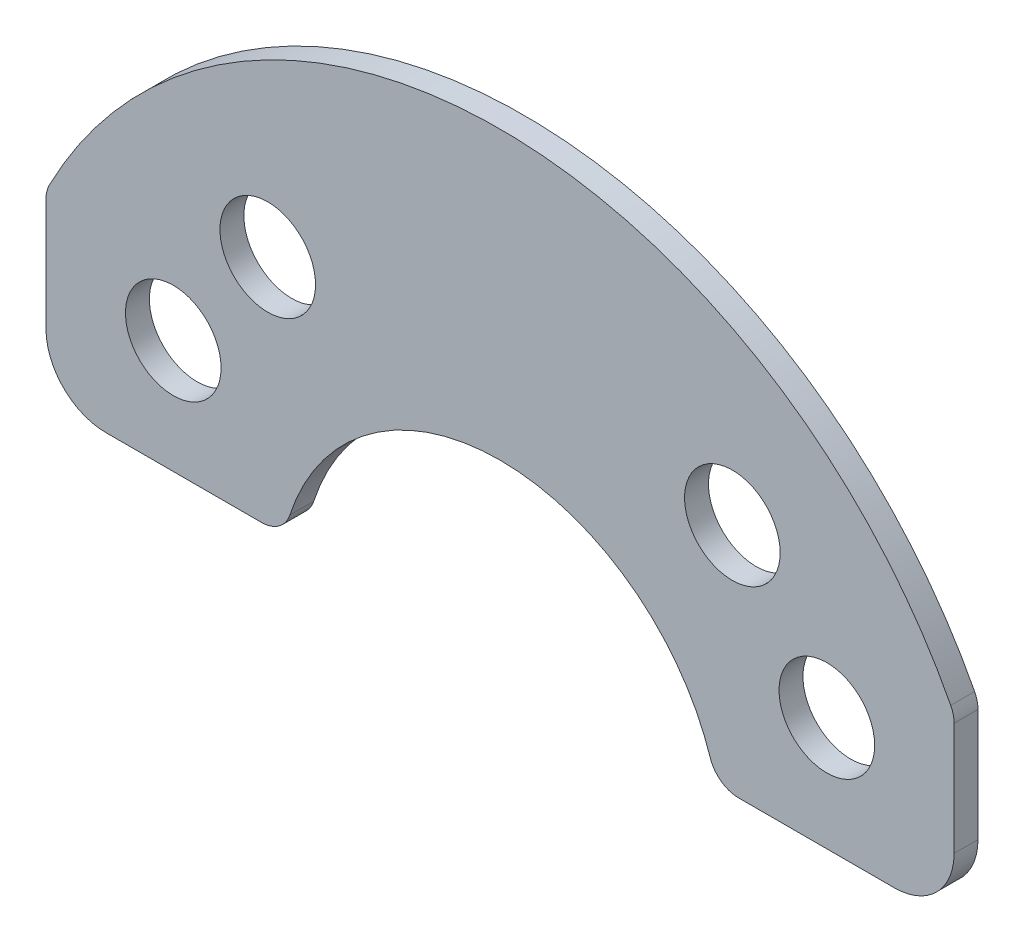
ISO-10303-21;
HEADER;
FILE_DESCRIPTION(('STEP AP214'),'2;1');
FILE_NAME('part.step','',(''),(''),'','','');
FILE_SCHEMA(('AUTOMOTIVE_DESIGN { 1 0 10303 214 1 1 1 1 }'));
ENDSEC;
DATA;
#1=APPLICATION_CONTEXT('core data for automotive mechanical design processes');
#2=APPLICATION_PROTOCOL_DEFINITION('international standard','automotive_design',2000,#1);
#3=PRODUCT_CONTEXT('',#1,'mechanical');
#4=PRODUCT('Part','Part','',(#3));
#5=PRODUCT_RELATED_PRODUCT_CATEGORY('part','',(#4));
#6=PRODUCT_DEFINITION_FORMATION('','',#4);
#7=PRODUCT_DEFINITION_CONTEXT('part definition',#1,'design');
#8=PRODUCT_DEFINITION('design','',#6,#7);
#9=PRODUCT_DEFINITION_SHAPE('','',#8);
#10=(LENGTH_UNIT() NAMED_UNIT(*) SI_UNIT(.MILLI.,.METRE.));
#11=(NAMED_UNIT(*) PLANE_ANGLE_UNIT() SI_UNIT($,.RADIAN.));
#12=(NAMED_UNIT(*) SI_UNIT($,.STERADIAN.) SOLID_ANGLE_UNIT());
#13=UNCERTAINTY_MEASURE_WITH_UNIT(LENGTH_MEASURE(1.E-05),#10,'distance_accuracy_value','');
#14=(GEOMETRIC_REPRESENTATION_CONTEXT(3) GLOBAL_UNCERTAINTY_ASSIGNED_CONTEXT((#13)) GLOBAL_UNIT_ASSIGNED_CONTEXT((#10,
#11,#12)) REPRESENTATION_CONTEXT('',''));
#15=CARTESIAN_POINT('',(0.,0.,0.));
#16=DIRECTION('',(0.,0.,1.));
#17=DIRECTION('',(1.,0.,0.));
#18=AXIS2_PLACEMENT_3D('',#15,#16,#17);
#19=CARTESIAN_POINT('',(-38.,4.,1.));
#20=DIRECTION('',(1.,0.,0.));
#21=DIRECTION('',(0.,1.,0.));
#22=AXIS2_PLACEMENT_3D('',#19,#20,#21);
#23=PLANE('',#22);
#24=DIRECTION('',(0.,-1.,0.));
#25=VECTOR('',#24,1.);
#26=CARTESIAN_POINT('',(-38.,4.,1.));
#27=LINE('',#26,#25);
#28=CARTESIAN_POINT('',(-38.,18.4323085911668,1.));
#29=VERTEX_POINT('',#28);
#30=CARTESIAN_POINT('',(-38.,9.,1.));
#31=VERTEX_POINT('',#30);
#32=EDGE_CURVE('E155',#29,#31,#27,.T.);
#33=ORIENTED_EDGE('',*,*,#32,.F.);
#34=DIRECTION('',(0.,0.,-1.));
#35=VECTOR('',#34,1.);
#36=CARTESIAN_POINT('',(-38.,18.4323085911668,1.));
#37=LINE('',#36,#35);
#38=CARTESIAN_POINT('',(-38.,18.4323085911668,-1.));
#39=VERTEX_POINT('',#38);
#40=EDGE_CURVE('E174',#29,#39,#37,.T.);
#41=ORIENTED_EDGE('',*,*,#40,.T.);
#42=DIRECTION('',(0.,-1.,0.));
#43=VECTOR('',#42,1.);
#44=CARTESIAN_POINT('',(-38.,4.,-1.));
#45=LINE('',#44,#43);
#46=CARTESIAN_POINT('',(-38.,9.,-1.));
#47=VERTEX_POINT('',#46);
#48=EDGE_CURVE('E213',#39,#47,#45,.T.);
#49=ORIENTED_EDGE('',*,*,#48,.T.);
#50=DIRECTION('',(0.,0.,-1.));
#51=VECTOR('',#50,1.);
#52=CARTESIAN_POINT('',(-38.,9.,1.));
#53=LINE('',#52,#51);
#54=EDGE_CURVE('E171',#47,#31,#53,.F.);
#55=ORIENTED_EDGE('',*,*,#54,.T.);
#56=EDGE_LOOP('',(#33,#41,#49,#55));
#57=FACE_BOUND('',#56,.T.);
#58=ADVANCED_FACE('F33',(#57),#23,.F.);
#59=CARTESIAN_POINT('',(-38.,4.,1.));
#60=DIRECTION('',(0.,1.,0.));
#61=DIRECTION('',(-1.,0.,0.));
#62=AXIS2_PLACEMENT_3D('',#59,#60,#61);
#63=PLANE('',#62);
#64=DIRECTION('',(1.,0.,0.));
#65=VECTOR('',#64,1.);
#66=CARTESIAN_POINT('',(-38.,4.,-1.));
#67=LINE('',#66,#65);
#68=CARTESIAN_POINT('',(-33.,4.,-1.));
#69=VERTEX_POINT('',#68);
#70=CARTESIAN_POINT('',(-19.9687255477159,4.,-1.));
#71=VERTEX_POINT('',#70);
#72=EDGE_CURVE('E234',#69,#71,#67,.T.);
#73=ORIENTED_EDGE('',*,*,#72,.T.);
#74=DIRECTION('',(0.,0.,-1.));
#75=VECTOR('',#74,1.);
#76=CARTESIAN_POINT('',(-19.9687255477159,4.,1.));
#77=LINE('',#76,#75);
#78=CARTESIAN_POINT('',(-19.9687255477159,4.,1.));
#79=VERTEX_POINT('',#78);
#80=EDGE_CURVE('E200',#71,#79,#77,.F.);
#81=ORIENTED_EDGE('',*,*,#80,.T.);
#82=DIRECTION('',(1.,0.,0.));
#83=VECTOR('',#82,1.);
#84=CARTESIAN_POINT('',(-38.,4.,1.));
#85=LINE('',#84,#83);
#86=CARTESIAN_POINT('',(-33.,4.,1.));
#87=VERTEX_POINT('',#86);
#88=EDGE_CURVE('E222',#87,#79,#85,.T.);
#89=ORIENTED_EDGE('',*,*,#88,.F.);
#90=DIRECTION('',(0.,0.,-1.));
#91=VECTOR('',#90,1.);
#92=CARTESIAN_POINT('',(-33.,4.,1.));
#93=LINE('',#92,#91);
#94=EDGE_CURVE('E168',#87,#69,#93,.T.);
#95=ORIENTED_EDGE('',*,*,#94,.T.);
#96=EDGE_LOOP('',(#73,#81,#89,#95));
#97=FACE_BOUND('',#96,.T.);
#98=ADVANCED_FACE('F253',(#97),#63,.F.);
#99=CARTESIAN_POINT('',(0.,0.,1.));
#100=DIRECTION('',(0.,0.,-1.));
#101=DIRECTION('',(-1.,0.,0.));
#102=AXIS2_PLACEMENT_3D('',#99,#100,#101);
#103=CYLINDRICAL_SURFACE('',#102,18.5);
#104=CARTESIAN_POINT('',(0.,0.,1.));
#105=DIRECTION('',(0.,0.,-1.));
#106=DIRECTION('',(1.,0.,0.));
#107=AXIS2_PLACEMENT_3D('',#104,#105,#106);
#108=CIRCLE('',#107,18.5);
#109=CARTESIAN_POINT('',(-17.5914963158449,5.72619047619048,1.));
#110=VERTEX_POINT('',#109);
#111=CARTESIAN_POINT('',(17.5914963158449,5.72619047619048,1.));
#112=VERTEX_POINT('',#111);
#113=EDGE_CURVE('E224',#110,#112,#108,.T.);
#114=ORIENTED_EDGE('',*,*,#113,.F.);
#115=DIRECTION('',(0.,0.,-1.));
#116=VECTOR('',#115,1.);
#117=CARTESIAN_POINT('',(-17.5914963158449,5.72619047619048,1.));
#118=LINE('',#117,#116);
#119=CARTESIAN_POINT('',(-17.5914963158449,5.72619047619048,-1.));
#120=VERTEX_POINT('',#119);
#121=EDGE_CURVE('E197',#110,#120,#118,.T.);
#122=ORIENTED_EDGE('',*,*,#121,.T.);
#123=CARTESIAN_POINT('',(0.,0.,-1.));
#124=DIRECTION('',(0.,0.,-1.));
#125=DIRECTION('',(1.,0.,0.));
#126=AXIS2_PLACEMENT_3D('',#123,#124,#125);
#127=CIRCLE('',#126,18.5);
#128=CARTESIAN_POINT('',(17.5914963158449,5.72619047619048,-1.));
#129=VERTEX_POINT('',#128);
#130=EDGE_CURVE('E157',#120,#129,#127,.T.);
#131=ORIENTED_EDGE('',*,*,#130,.T.);
#132=DIRECTION('',(0.,0.,-1.));
#133=VECTOR('',#132,1.);
#134=CARTESIAN_POINT('',(17.5914963158449,5.72619047619048,1.));
#135=LINE('',#134,#133);
#136=EDGE_CURVE('E48',#129,#112,#135,.F.);
#137=ORIENTED_EDGE('',*,*,#136,.T.);
#138=EDGE_LOOP('',(#114,#122,#131,#137));
#139=FACE_BOUND('',#138,.T.);
#140=ADVANCED_FACE('F238',(#139),#103,.F.);
#141=CARTESIAN_POINT('',(18.0623918681884,4.00000000000001,1.));
#142=DIRECTION('',(0.,1.,0.));
#143=DIRECTION('',(-1.,0.,0.));
#144=AXIS2_PLACEMENT_3D('',#141,#142,#143);
#145=PLANE('',#144);
#146=DIRECTION('',(1.,0.,0.));
#147=VECTOR('',#146,1.);
#148=CARTESIAN_POINT('',(18.0623918681884,4.00000000000001,1.));
#149=LINE('',#148,#147);
#150=CARTESIAN_POINT('',(19.9687255477159,4.00000000000001,1.));
#151=VERTEX_POINT('',#150);
#152=CARTESIAN_POINT('',(33.,4.,1.));
#153=VERTEX_POINT('',#152);
#154=EDGE_CURVE('E206',#151,#153,#149,.T.);
#155=ORIENTED_EDGE('',*,*,#154,.F.);
#156=DIRECTION('',(0.,0.,-1.));
#157=VECTOR('',#156,1.);
#158=CARTESIAN_POINT('',(19.9687255477159,4.00000000000001,1.));
#159=LINE('',#158,#157);
#160=CARTESIAN_POINT('',(19.9687255477159,4.00000000000001,-1.));
#161=VERTEX_POINT('',#160);
#162=EDGE_CURVE('E11',#151,#161,#159,.T.);
#163=ORIENTED_EDGE('',*,*,#162,.T.);
#164=DIRECTION('',(1.,0.,0.));
#165=VECTOR('',#164,1.);
#166=CARTESIAN_POINT('',(18.0623918681884,4.00000000000001,-1.));
#167=LINE('',#166,#165);
#168=CARTESIAN_POINT('',(33.,4.,-1.));
#169=VERTEX_POINT('',#168);
#170=EDGE_CURVE('E152',#161,#169,#167,.T.);
#171=ORIENTED_EDGE('',*,*,#170,.T.);
#172=DIRECTION('',(0.,0.,-1.));
#173=VECTOR('',#172,1.);
#174=CARTESIAN_POINT('',(33.,4.,1.));
#175=LINE('',#174,#173);
#176=EDGE_CURVE('E131',#169,#153,#175,.F.);
#177=ORIENTED_EDGE('',*,*,#176,.T.);
#178=EDGE_LOOP('',(#155,#163,#171,#177));
#179=FACE_BOUND('',#178,.T.);
#180=ADVANCED_FACE('F245',(#179),#145,.F.);
#181=CARTESIAN_POINT('',(38.,4.,1.));
#182=DIRECTION('',(-1.,0.,0.));
#183=DIRECTION('',(0.,-1.,0.));
#184=AXIS2_PLACEMENT_3D('',#181,#182,#183);
#185=PLANE('',#184);
#186=DIRECTION('',(0.,1.,0.));
#187=VECTOR('',#186,1.);
#188=CARTESIAN_POINT('',(38.,4.,-1.));
#189=LINE('',#188,#187);
#190=CARTESIAN_POINT('',(38.,9.,-1.));
#191=VERTEX_POINT('',#190);
#192=CARTESIAN_POINT('',(38.,18.4323085911668,-1.));
#193=VERTEX_POINT('',#192);
#194=EDGE_CURVE('E141',#191,#193,#189,.T.);
#195=ORIENTED_EDGE('',*,*,#194,.T.);
#196=DIRECTION('',(0.,0.,-1.));
#197=VECTOR('',#196,1.);
#198=CARTESIAN_POINT('',(38.,18.4323085911668,1.));
#199=LINE('',#198,#197);
#200=CARTESIAN_POINT('',(38.,18.4323085911668,1.));
#201=VERTEX_POINT('',#200);
#202=EDGE_CURVE('E41',#193,#201,#199,.F.);
#203=ORIENTED_EDGE('',*,*,#202,.T.);
#204=DIRECTION('',(0.,1.,0.));
#205=VECTOR('',#204,1.);
#206=CARTESIAN_POINT('',(38.,4.,1.));
#207=LINE('',#206,#205);
#208=CARTESIAN_POINT('',(38.,9.,1.));
#209=VERTEX_POINT('',#208);
#210=EDGE_CURVE('E144',#209,#201,#207,.T.);
#211=ORIENTED_EDGE('',*,*,#210,.F.);
#212=DIRECTION('',(0.,0.,-1.));
#213=VECTOR('',#212,1.);
#214=CARTESIAN_POINT('',(38.,9.,1.));
#215=LINE('',#214,#213);
#216=EDGE_CURVE('E129',#209,#191,#215,.T.);
#217=ORIENTED_EDGE('',*,*,#216,.T.);
#218=EDGE_LOOP('',(#195,#203,#211,#217));
#219=FACE_BOUND('',#218,.T.);
#220=ADVANCED_FACE('F140',(#219),#185,.F.);
#221=CARTESIAN_POINT('',(0.,0.,1.));
#222=DIRECTION('',(0.,0.,-1.));
#223=DIRECTION('',(-1.,0.,0.));
#224=AXIS2_PLACEMENT_3D('',#221,#222,#223);
#225=CYLINDRICAL_SURFACE('',#224,42.5);
#226=CARTESIAN_POINT('',(0.,0.,-1.));
#227=DIRECTION('',(0.,0.,1.));
#228=DIRECTION('',(1.,0.,0.));
#229=AXIS2_PLACEMENT_3D('',#226,#227,#228);
#230=CIRCLE('',#229,42.5);
#231=CARTESIAN_POINT('',(37.71875,19.5843278781147,-1.));
#232=VERTEX_POINT('',#231);
#233=CARTESIAN_POINT('',(-37.71875,19.5843278781147,-1.));
#234=VERTEX_POINT('',#233);
#235=EDGE_CURVE('E151',#232,#234,#230,.T.);
#236=ORIENTED_EDGE('',*,*,#235,.T.);
#237=DIRECTION('',(0.,0.,-1.));
#238=VECTOR('',#237,1.);
#239=CARTESIAN_POINT('',(-37.71875,19.5843278781147,1.));
#240=LINE('',#239,#238);
#241=CARTESIAN_POINT('',(-37.71875,19.5843278781147,1.));
#242=VERTEX_POINT('',#241);
#243=EDGE_CURVE('E187',#234,#242,#240,.F.);
#244=ORIENTED_EDGE('',*,*,#243,.T.);
#245=CARTESIAN_POINT('',(0.,0.,1.));
#246=DIRECTION('',(0.,0.,1.));
#247=DIRECTION('',(1.,0.,0.));
#248=AXIS2_PLACEMENT_3D('',#245,#246,#247);
#249=CIRCLE('',#248,42.5);
#250=CARTESIAN_POINT('',(37.71875,19.5843278781147,1.));
#251=VERTEX_POINT('',#250);
#252=EDGE_CURVE('E145',#251,#242,#249,.T.);
#253=ORIENTED_EDGE('',*,*,#252,.F.);
#254=DIRECTION('',(0.,0.,-1.));
#255=VECTOR('',#254,1.);
#256=CARTESIAN_POINT('',(37.71875,19.5843278781147,1.));
#257=LINE('',#256,#255);
#258=EDGE_CURVE('E184',#251,#232,#257,.T.);
#259=ORIENTED_EDGE('',*,*,#258,.T.);
#260=EDGE_LOOP('',(#236,#244,#253,#259));
#261=FACE_BOUND('',#260,.T.);
#262=ADVANCED_FACE('F211',(#261),#225,.T.);
#263=CARTESIAN_POINT('',(0.,0.,1.));
#264=DIRECTION('',(0.,0.,1.));
#265=DIRECTION('',(1.,0.,0.));
#266=AXIS2_PLACEMENT_3D('',#263,#264,#265);
#267=PLANE('',#266);
#268=CARTESIAN_POINT('',(27.3495886623547,13.5,1.));
#269=DIRECTION('',(0.,0.,1.));
#270=DIRECTION('',(1.,0.,0.));
#271=AXIS2_PLACEMENT_3D('',#268,#269,#270);
#272=CIRCLE('',#271,4.);
#273=CARTESIAN_POINT('',(31.3495886623547,13.5,1.));
#274=VERTEX_POINT('',#273);
#275=EDGE_CURVE('E410',#274,#274,#272,.T.);
#276=ORIENTED_EDGE('',*,*,#275,.F.);
#277=EDGE_LOOP('',(#276));
#278=FACE_BOUND('',#277,.T.);
#279=CARTESIAN_POINT('',(19.4422220952236,23.5,1.));
#280=DIRECTION('',(0.,0.,1.));
#281=DIRECTION('',(1.,0.,0.));
#282=AXIS2_PLACEMENT_3D('',#279,#280,#281);
#283=CIRCLE('',#282,4.);
#284=CARTESIAN_POINT('',(23.4422220952236,23.5,1.));
#285=VERTEX_POINT('',#284);
#286=EDGE_CURVE('E412',#285,#285,#283,.T.);
#287=ORIENTED_EDGE('',*,*,#286,.F.);
#288=EDGE_LOOP('',(#287));
#289=FACE_BOUND('',#288,.T.);
#290=CARTESIAN_POINT('',(-19.4422220952236,23.5,1.));
#291=DIRECTION('',(0.,0.,1.));
#292=DIRECTION('',(1.,0.,0.));
#293=AXIS2_PLACEMENT_3D('',#290,#291,#292);
#294=CIRCLE('',#293,4.);
#295=CARTESIAN_POINT('',(-15.4422220952236,23.5,1.));
#296=VERTEX_POINT('',#295);
#297=EDGE_CURVE('E423',#296,#296,#294,.T.);
#298=ORIENTED_EDGE('',*,*,#297,.F.);
#299=EDGE_LOOP('',(#298));
#300=FACE_BOUND('',#299,.T.);
#301=CARTESIAN_POINT('',(-27.3495886623547,13.5,1.));
#302=DIRECTION('',(0.,0.,1.));
#303=DIRECTION('',(1.,0.,0.));
#304=AXIS2_PLACEMENT_3D('',#301,#302,#303);
#305=CIRCLE('',#304,4.);
#306=CARTESIAN_POINT('',(-23.3495886623547,13.5,1.));
#307=VERTEX_POINT('',#306);
#308=EDGE_CURVE('E227',#307,#307,#305,.T.);
#309=ORIENTED_EDGE('',*,*,#308,.F.);
#310=EDGE_LOOP('',(#309));
#311=FACE_BOUND('',#310,.T.);
#312=ORIENTED_EDGE('',*,*,#252,.T.);
#313=CARTESIAN_POINT('',(-35.5,18.4323085911668,1.));
#314=DIRECTION('',(0.,0.,1.));
#315=DIRECTION('',(1.,0.,0.));
#316=AXIS2_PLACEMENT_3D('',#313,#314,#315);
#317=CIRCLE('',#316,2.5);
#318=EDGE_CURVE('E194',#242,#29,#317,.T.);
#319=ORIENTED_EDGE('',*,*,#318,.T.);
#320=ORIENTED_EDGE('',*,*,#32,.T.);
#321=CARTESIAN_POINT('',(-33.,9.,1.));
#322=DIRECTION('',(0.,0.,1.));
#323=DIRECTION('',(1.,0.,0.));
#324=AXIS2_PLACEMENT_3D('',#321,#322,#323);
#325=CIRCLE('',#324,5.);
#326=EDGE_CURVE('E164',#31,#87,#325,.T.);
#327=ORIENTED_EDGE('',*,*,#326,.T.);
#328=ORIENTED_EDGE('',*,*,#88,.T.);
#329=CARTESIAN_POINT('',(-19.9687255477159,6.5,1.));
#330=DIRECTION('',(0.,0.,1.));
#331=DIRECTION('',(1.,0.,0.));
#332=AXIS2_PLACEMENT_3D('',#329,#330,#331);
#333=CIRCLE('',#332,2.5);
#334=EDGE_CURVE('E55',#79,#110,#333,.T.);
#335=ORIENTED_EDGE('',*,*,#334,.T.);
#336=ORIENTED_EDGE('',*,*,#113,.T.);
#337=CARTESIAN_POINT('',(19.9687255477159,6.50000000000001,1.));
#338=DIRECTION('',(0.,0.,1.));
#339=DIRECTION('',(1.,0.,0.));
#340=AXIS2_PLACEMENT_3D('',#337,#338,#339);
#341=CIRCLE('',#340,2.5);
#342=EDGE_CURVE('E189',#112,#151,#341,.T.);
#343=ORIENTED_EDGE('',*,*,#342,.T.);
#344=ORIENTED_EDGE('',*,*,#154,.T.);
#345=CARTESIAN_POINT('',(33.,9.,1.));
#346=DIRECTION('',(0.,0.,1.));
#347=DIRECTION('',(1.,0.,0.));
#348=AXIS2_PLACEMENT_3D('',#345,#346,#347);
#349=CIRCLE('',#348,5.);
#350=EDGE_CURVE('E166',#153,#209,#349,.T.);
#351=ORIENTED_EDGE('',*,*,#350,.T.);
#352=ORIENTED_EDGE('',*,*,#210,.T.);
#353=CARTESIAN_POINT('',(35.5,18.4323085911668,1.));
#354=DIRECTION('',(0.,0.,1.));
#355=DIRECTION('',(1.,0.,0.));
#356=AXIS2_PLACEMENT_3D('',#353,#354,#355);
#357=CIRCLE('',#356,2.5);
#358=EDGE_CURVE('E191',#201,#251,#357,.T.);
#359=ORIENTED_EDGE('',*,*,#358,.T.);
#360=EDGE_LOOP('',(#312,#319,#320,#327,#328,#335,#336,#343,#344,#351,#352,#359));
#361=FACE_BOUND('',#360,.T.);
#362=ADVANCED_FACE('F204',(#278,#289,#300,#311,#361),#267,.T.);
#363=CARTESIAN_POINT('',(0.,0.,-1.));
#364=DIRECTION('',(0.,0.,1.));
#365=DIRECTION('',(1.,0.,0.));
#366=AXIS2_PLACEMENT_3D('',#363,#364,#365);
#367=PLANE('',#366);
#368=CARTESIAN_POINT('',(27.3495886623547,13.5,-1.));
#369=DIRECTION('',(0.,0.,1.));
#370=DIRECTION('',(1.,0.,0.));
#371=AXIS2_PLACEMENT_3D('',#368,#369,#370);
#372=CIRCLE('',#371,4.);
#373=CARTESIAN_POINT('',(31.3495886623547,13.5,-1.));
#374=VERTEX_POINT('',#373);
#375=EDGE_CURVE('E407',#374,#374,#372,.T.);
#376=ORIENTED_EDGE('',*,*,#375,.T.);
#377=EDGE_LOOP('',(#376));
#378=FACE_BOUND('',#377,.T.);
#379=CARTESIAN_POINT('',(19.4422220952236,23.5,-1.));
#380=DIRECTION('',(0.,0.,1.));
#381=DIRECTION('',(1.,0.,0.));
#382=AXIS2_PLACEMENT_3D('',#379,#380,#381);
#383=CIRCLE('',#382,4.);
#384=CARTESIAN_POINT('',(23.4422220952236,23.5,-1.));
#385=VERTEX_POINT('',#384);
#386=EDGE_CURVE('E428',#385,#385,#383,.T.);
#387=ORIENTED_EDGE('',*,*,#386,.T.);
#388=EDGE_LOOP('',(#387));
#389=FACE_BOUND('',#388,.T.);
#390=CARTESIAN_POINT('',(-19.4422220952236,23.5,-1.));
#391=DIRECTION('',(0.,0.,1.));
#392=DIRECTION('',(1.,0.,0.));
#393=AXIS2_PLACEMENT_3D('',#390,#391,#392);
#394=CIRCLE('',#393,4.);
#395=CARTESIAN_POINT('',(-15.4422220952236,23.5,-1.));
#396=VERTEX_POINT('',#395);
#397=EDGE_CURVE('E419',#396,#396,#394,.T.);
#398=ORIENTED_EDGE('',*,*,#397,.T.);
#399=EDGE_LOOP('',(#398));
#400=FACE_BOUND('',#399,.T.);
#401=CARTESIAN_POINT('',(-27.3495886623547,13.5,-1.));
#402=DIRECTION('',(0.,0.,1.));
#403=DIRECTION('',(1.,0.,0.));
#404=AXIS2_PLACEMENT_3D('',#401,#402,#403);
#405=CIRCLE('',#404,4.);
#406=CARTESIAN_POINT('',(-23.3495886623547,13.5,-1.));
#407=VERTEX_POINT('',#406);
#408=EDGE_CURVE('E235',#407,#407,#405,.T.);
#409=ORIENTED_EDGE('',*,*,#408,.T.);
#410=EDGE_LOOP('',(#409));
#411=FACE_BOUND('',#410,.T.);
#412=ORIENTED_EDGE('',*,*,#48,.F.);
#413=CARTESIAN_POINT('',(-35.5,18.4323085911668,-1.));
#414=DIRECTION('',(0.,0.,1.));
#415=DIRECTION('',(1.,0.,0.));
#416=AXIS2_PLACEMENT_3D('',#413,#414,#415);
#417=CIRCLE('',#416,2.5);
#418=EDGE_CURVE('E182',#39,#234,#417,.F.);
#419=ORIENTED_EDGE('',*,*,#418,.T.);
#420=ORIENTED_EDGE('',*,*,#235,.F.);
#421=CARTESIAN_POINT('',(35.5,18.4323085911668,-1.));
#422=DIRECTION('',(0.,0.,1.));
#423=DIRECTION('',(1.,0.,0.));
#424=AXIS2_PLACEMENT_3D('',#421,#422,#423);
#425=CIRCLE('',#424,2.5);
#426=EDGE_CURVE('E150',#232,#193,#425,.F.);
#427=ORIENTED_EDGE('',*,*,#426,.T.);
#428=ORIENTED_EDGE('',*,*,#194,.F.);
#429=CARTESIAN_POINT('',(33.,9.,-1.));
#430=DIRECTION('',(0.,0.,1.));
#431=DIRECTION('',(1.,0.,0.));
#432=AXIS2_PLACEMENT_3D('',#429,#430,#431);
#433=CIRCLE('',#432,5.);
#434=EDGE_CURVE('E125',#191,#169,#433,.F.);
#435=ORIENTED_EDGE('',*,*,#434,.T.);
#436=ORIENTED_EDGE('',*,*,#170,.F.);
#437=CARTESIAN_POINT('',(19.9687255477159,6.50000000000001,-1.));
#438=DIRECTION('',(0.,0.,1.));
#439=DIRECTION('',(1.,0.,0.));
#440=AXIS2_PLACEMENT_3D('',#437,#438,#439);
#441=CIRCLE('',#440,2.5);
#442=EDGE_CURVE('E177',#161,#129,#441,.F.);
#443=ORIENTED_EDGE('',*,*,#442,.T.);
#444=ORIENTED_EDGE('',*,*,#130,.F.);
#445=CARTESIAN_POINT('',(-19.9687255477159,6.5,-1.));
#446=DIRECTION('',(0.,0.,1.));
#447=DIRECTION('',(1.,0.,0.));
#448=AXIS2_PLACEMENT_3D('',#445,#446,#447);
#449=CIRCLE('',#448,2.5);
#450=EDGE_CURVE('E180',#120,#71,#449,.F.);
#451=ORIENTED_EDGE('',*,*,#450,.T.);
#452=ORIENTED_EDGE('',*,*,#72,.F.);
#453=CARTESIAN_POINT('',(-33.,9.,-1.));
#454=DIRECTION('',(0.,0.,1.));
#455=DIRECTION('',(1.,0.,0.));
#456=AXIS2_PLACEMENT_3D('',#453,#454,#455);
#457=CIRCLE('',#456,5.);
#458=EDGE_CURVE('E135',#69,#47,#457,.F.);
#459=ORIENTED_EDGE('',*,*,#458,.T.);
#460=EDGE_LOOP('',(#412,#419,#420,#427,#428,#435,#436,#443,#444,#451,#452,#459));
#461=FACE_BOUND('',#460,.T.);
#462=ADVANCED_FACE('F148',(#378,#389,#400,#411,#461),#367,.F.);
#463=CARTESIAN_POINT('',(-27.3495886623547,13.5,-1.));
#464=DIRECTION('',(0.,0.,1.));
#465=DIRECTION('',(1.,0.,0.));
#466=AXIS2_PLACEMENT_3D('',#463,#464,#465);
#467=CYLINDRICAL_SURFACE('',#466,4.);
#468=ORIENTED_EDGE('',*,*,#408,.F.);
#469=EDGE_LOOP('',(#468));
#470=FACE_BOUND('',#469,.T.);
#471=ORIENTED_EDGE('',*,*,#308,.T.);
#472=EDGE_LOOP('',(#471));
#473=FACE_BOUND('',#472,.T.);
#474=ADVANCED_FACE('F307',(#470,#473),#467,.F.);
#475=CARTESIAN_POINT('',(-19.4422220952236,23.5,-1.));
#476=DIRECTION('',(0.,0.,1.));
#477=DIRECTION('',(1.,0.,0.));
#478=AXIS2_PLACEMENT_3D('',#475,#476,#477);
#479=CYLINDRICAL_SURFACE('',#478,4.);
#480=ORIENTED_EDGE('',*,*,#397,.F.);
#481=EDGE_LOOP('',(#480));
#482=FACE_BOUND('',#481,.T.);
#483=ORIENTED_EDGE('',*,*,#297,.T.);
#484=EDGE_LOOP('',(#483));
#485=FACE_BOUND('',#484,.T.);
#486=ADVANCED_FACE('F362',(#482,#485),#479,.F.);
#487=CARTESIAN_POINT('',(19.4422220952236,23.5,-1.));
#488=DIRECTION('',(0.,0.,1.));
#489=DIRECTION('',(1.,0.,0.));
#490=AXIS2_PLACEMENT_3D('',#487,#488,#489);
#491=CYLINDRICAL_SURFACE('',#490,4.);
#492=ORIENTED_EDGE('',*,*,#386,.F.);
#493=EDGE_LOOP('',(#492));
#494=FACE_BOUND('',#493,.T.);
#495=ORIENTED_EDGE('',*,*,#286,.T.);
#496=EDGE_LOOP('',(#495));
#497=FACE_BOUND('',#496,.T.);
#498=ADVANCED_FACE('F371',(#494,#497),#491,.F.);
#499=CARTESIAN_POINT('',(27.3495886623547,13.5,-1.));
#500=DIRECTION('',(0.,0.,1.));
#501=DIRECTION('',(1.,0.,0.));
#502=AXIS2_PLACEMENT_3D('',#499,#500,#501);
#503=CYLINDRICAL_SURFACE('',#502,4.);
#504=ORIENTED_EDGE('',*,*,#375,.F.);
#505=EDGE_LOOP('',(#504));
#506=FACE_BOUND('',#505,.T.);
#507=ORIENTED_EDGE('',*,*,#275,.T.);
#508=EDGE_LOOP('',(#507));
#509=FACE_BOUND('',#508,.T.);
#510=ADVANCED_FACE('F267',(#506,#509),#503,.F.);
#511=CARTESIAN_POINT('',(33.,9.,1.));
#512=DIRECTION('',(0.,0.,-1.));
#513=DIRECTION('',(-1.,0.,0.));
#514=AXIS2_PLACEMENT_3D('',#511,#512,#513);
#515=CYLINDRICAL_SURFACE('',#514,5.);
#516=ORIENTED_EDGE('',*,*,#350,.F.);
#517=ORIENTED_EDGE('',*,*,#176,.F.);
#518=ORIENTED_EDGE('',*,*,#434,.F.);
#519=ORIENTED_EDGE('',*,*,#216,.F.);
#520=EDGE_LOOP('',(#516,#517,#518,#519));
#521=FACE_BOUND('',#520,.T.);
#522=ADVANCED_FACE('F128',(#521),#515,.T.);
#523=CARTESIAN_POINT('',(-33.,9.,1.));
#524=DIRECTION('',(0.,0.,-1.));
#525=DIRECTION('',(-1.,0.,0.));
#526=AXIS2_PLACEMENT_3D('',#523,#524,#525);
#527=CYLINDRICAL_SURFACE('',#526,5.);
#528=ORIENTED_EDGE('',*,*,#326,.F.);
#529=ORIENTED_EDGE('',*,*,#54,.F.);
#530=ORIENTED_EDGE('',*,*,#458,.F.);
#531=ORIENTED_EDGE('',*,*,#94,.F.);
#532=EDGE_LOOP('',(#528,#529,#530,#531));
#533=FACE_BOUND('',#532,.T.);
#534=ADVANCED_FACE('F266',(#533),#527,.T.);
#535=CARTESIAN_POINT('',(-35.5,18.4323085911668,1.));
#536=DIRECTION('',(0.,0.,-1.));
#537=DIRECTION('',(-1.,0.,0.));
#538=AXIS2_PLACEMENT_3D('',#535,#536,#537);
#539=CYLINDRICAL_SURFACE('',#538,2.5);
#540=ORIENTED_EDGE('',*,*,#318,.F.);
#541=ORIENTED_EDGE('',*,*,#243,.F.);
#542=ORIENTED_EDGE('',*,*,#418,.F.);
#543=ORIENTED_EDGE('',*,*,#40,.F.);
#544=EDGE_LOOP('',(#540,#541,#542,#543));
#545=FACE_BOUND('',#544,.T.);
#546=ADVANCED_FACE('F217',(#545),#539,.T.);
#547=CARTESIAN_POINT('',(-19.9687255477159,6.5,1.));
#548=DIRECTION('',(0.,0.,-1.));
#549=DIRECTION('',(-1.,0.,0.));
#550=AXIS2_PLACEMENT_3D('',#547,#548,#549);
#551=CYLINDRICAL_SURFACE('',#550,2.5);
#552=ORIENTED_EDGE('',*,*,#334,.F.);
#553=ORIENTED_EDGE('',*,*,#80,.F.);
#554=ORIENTED_EDGE('',*,*,#450,.F.);
#555=ORIENTED_EDGE('',*,*,#121,.F.);
#556=EDGE_LOOP('',(#552,#553,#554,#555));
#557=FACE_BOUND('',#556,.T.);
#558=ADVANCED_FACE('F273',(#557),#551,.T.);
#559=CARTESIAN_POINT('',(35.5,18.4323085911668,1.));
#560=DIRECTION('',(0.,0.,-1.));
#561=DIRECTION('',(-1.,0.,0.));
#562=AXIS2_PLACEMENT_3D('',#559,#560,#561);
#563=CYLINDRICAL_SURFACE('',#562,2.5);
#564=ORIENTED_EDGE('',*,*,#358,.F.);
#565=ORIENTED_EDGE('',*,*,#202,.F.);
#566=ORIENTED_EDGE('',*,*,#426,.F.);
#567=ORIENTED_EDGE('',*,*,#258,.F.);
#568=EDGE_LOOP('',(#564,#565,#566,#567));
#569=FACE_BOUND('',#568,.T.);
#570=ADVANCED_FACE('F209',(#569),#563,.T.);
#571=CARTESIAN_POINT('',(19.9687255477159,6.50000000000001,1.));
#572=DIRECTION('',(0.,0.,-1.));
#573=DIRECTION('',(-1.,0.,0.));
#574=AXIS2_PLACEMENT_3D('',#571,#572,#573);
#575=CYLINDRICAL_SURFACE('',#574,2.5);
#576=ORIENTED_EDGE('',*,*,#342,.F.);
#577=ORIENTED_EDGE('',*,*,#136,.F.);
#578=ORIENTED_EDGE('',*,*,#442,.F.);
#579=ORIENTED_EDGE('',*,*,#162,.F.);
#580=EDGE_LOOP('',(#576,#577,#578,#579));
#581=FACE_BOUND('',#580,.T.);
#582=ADVANCED_FACE('F35',(#581),#575,.T.);
#583=CLOSED_SHELL('',(#58,#98,#140,#180,#220,#262,#362,#462,#474,#486,#498,#510,#522,#534,#546,
#558,#570,#582));
#584=MANIFOLD_SOLID_BREP('B2',#583);
#585=ADVANCED_BREP_SHAPE_REPRESENTATION('',(#18,#584),#14);
#586=SHAPE_DEFINITION_REPRESENTATION(#9,#585);
ENDSEC;
END-ISO-10303-21;
